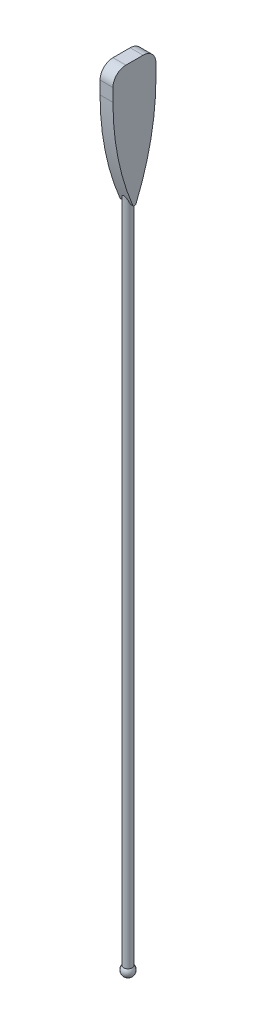
ISO-10303-21;
HEADER;
FILE_DESCRIPTION(('STEP AP214'),'2;1');
FILE_NAME('part.step','',(''),(''),'','','');
FILE_SCHEMA(('AUTOMOTIVE_DESIGN { 1 0 10303 214 1 1 1 1 }'));
ENDSEC;
DATA;
#1=APPLICATION_CONTEXT('core data for automotive mechanical design processes');
#2=APPLICATION_PROTOCOL_DEFINITION('international standard','automotive_design',2000,#1);
#3=PRODUCT_CONTEXT('',#1,'mechanical');
#4=PRODUCT('Part','Part','',(#3));
#5=PRODUCT_RELATED_PRODUCT_CATEGORY('part','',(#4));
#6=PRODUCT_DEFINITION_FORMATION('','',#4);
#7=PRODUCT_DEFINITION_CONTEXT('part definition',#1,'design');
#8=PRODUCT_DEFINITION('design','',#6,#7);
#9=PRODUCT_DEFINITION_SHAPE('','',#8);
#10=(LENGTH_UNIT() NAMED_UNIT(*) SI_UNIT(.MILLI.,.METRE.));
#11=(NAMED_UNIT(*) PLANE_ANGLE_UNIT() SI_UNIT($,.RADIAN.));
#12=(NAMED_UNIT(*) SI_UNIT($,.STERADIAN.) SOLID_ANGLE_UNIT());
#13=UNCERTAINTY_MEASURE_WITH_UNIT(LENGTH_MEASURE(1.E-05),#10,'distance_accuracy_value','');
#14=(GEOMETRIC_REPRESENTATION_CONTEXT(3) GLOBAL_UNCERTAINTY_ASSIGNED_CONTEXT((#13)) GLOBAL_UNIT_ASSIGNED_CONTEXT((#10,
#11,#12)) REPRESENTATION_CONTEXT('',''));
#15=CARTESIAN_POINT('',(0.,0.,0.));
#16=DIRECTION('',(0.,0.,1.));
#17=DIRECTION('',(1.,0.,0.));
#18=AXIS2_PLACEMENT_3D('',#15,#16,#17);
#19=CARTESIAN_POINT('',(0.,46.,0.));
#20=DIRECTION('',(0.,1.,0.));
#21=DIRECTION('',(-1.,0.,0.));
#22=AXIS2_PLACEMENT_3D('',#19,#20,#21);
#23=CYLINDRICAL_SURFACE('',#22,0.250000000000003);
#24=CARTESIAN_POINT('',(0.,0.226271736645453,0.));
#25=DIRECTION('',(0.,1.,0.));
#26=DIRECTION('',(-1.,0.,0.));
#27=AXIS2_PLACEMENT_3D('',#24,#25,#26);
#28=CIRCLE('',#27,0.25);
#29=CARTESIAN_POINT('',(-0.249999999999994,0.226271736645453,0.));
#30=VERTEX_POINT('',#29);
#31=EDGE_CURVE('E158',#30,#30,#28,.T.);
#32=ORIENTED_EDGE('',*,*,#31,.T.);
#33=EDGE_LOOP('',(#32));
#34=FACE_BOUND('',#33,.T.);
#35=CARTESIAN_POINT('',(-0.250000000000002,38.5052105958591,0.));
#36=CARTESIAN_POINT('',(-0.249999842543184,38.5366312632142,0.0136989494232212));
#37=CARTESIAN_POINT('',(-0.248879926101034,38.5680975482591,0.0272893989177539));
#38=CARTESIAN_POINT('',(-0.244435107894464,38.6309903938325,0.054198497885878));
#39=CARTESIAN_POINT('',(-0.241110239558626,38.6624169549561,0.0675171514769262));
#40=CARTESIAN_POINT('',(-0.232115953732347,38.7252729094795,0.0939046005377676));
#41=CARTESIAN_POINT('',(-0.226432614591263,38.756701192727,0.10697142199832));
#42=CARTESIAN_POINT('',(-0.212399886787121,38.8190910718342,0.13266587944311));
#43=CARTESIAN_POINT('',(-0.204054068522488,38.8500532348652,0.145294078616799));
#44=CARTESIAN_POINT('',(-0.183951385095789,38.9113633624454,0.170065761442661));
#45=CARTESIAN_POINT('',(-0.172175159533656,38.9417067649878,0.182206036124886));
#46=CARTESIAN_POINT('',(-0.150804609444333,38.985567903877,0.199598072160068));
#47=CARTESIAN_POINT('',(-0.143107010601811,38.9998508842895,0.205235028401046));
#48=CARTESIAN_POINT('',(-0.126076899123016,39.0275497703194,0.216119946348685));
#49=CARTESIAN_POINT('',(-0.11674967046122,39.0409682920755,0.221369089545257));
#50=CARTESIAN_POINT('',(-0.100751462483137,39.0602413612992,0.228879712209256));
#51=CARTESIAN_POINT('',(-0.0949022893026338,39.0666786649374,0.23138271195135));
#52=CARTESIAN_POINT('',(-0.082421085376727,39.0788783047938,0.236117471366797));
#53=CARTESIAN_POINT('',(-0.0757893046812715,39.0846408554352,0.238349317216126));
#54=CARTESIAN_POINT('',(-0.0633282138400703,39.093850010328,0.24191054182887));
#55=CARTESIAN_POINT('',(-0.0576915524361785,39.0975198958427,0.243327724579282));
#56=CARTESIAN_POINT('',(-0.0458738688724719,39.1040028322545,0.245828900951743));
#57=CARTESIAN_POINT('',(-0.0396939309828753,39.1068175420078,0.246913539675141));
#58=CARTESIAN_POINT('',(-0.0283181857865442,39.1107846519105,0.248441393034151));
#59=CARTESIAN_POINT('',(-0.0232164669001566,39.1121691534189,0.248974241624185));
#60=CARTESIAN_POINT('',(-0.0128367415336553,39.1141182157389,0.249724230786358));
#61=CARTESIAN_POINT('',(-0.00755893494560432,39.1146836759503,0.249941717661488));
#62=CARTESIAN_POINT('',(0.00303395590436785,39.1149334784053,0.250037806586286));
#63=CARTESIAN_POINT('',(0.00834909916075373,39.1146157080067,0.249915596097273));
#64=CARTESIAN_POINT('',(0.0188417672772986,39.1131313558093,0.249344513413491));
#65=CARTESIAN_POINT('',(0.0240191640926846,39.111964011012,0.248895347581789));
#66=CARTESIAN_POINT('',(0.0354297272937336,39.1084948909117,0.247559675573993));
#67=CARTESIAN_POINT('',(0.0415864345270877,39.1059767654535,0.246589704461534));
#68=CARTESIAN_POINT('',(0.0533884895246544,39.1000577518847,0.244307193625041));
#69=CARTESIAN_POINT('',(0.0590327019780229,39.0966549654336,0.242993917189125));
#70=CARTESIAN_POINT('',(0.0733433392008322,39.0867820632865,0.239178474104178));
#71=CARTESIAN_POINT('',(0.0815681310684482,39.0797626236356,0.236460973123727));
#72=CARTESIAN_POINT('',(0.0968567345089884,39.0647140850888,0.230619927147418));
#73=CARTESIAN_POINT('',(0.10391710137983,39.0566821102499,0.227495224672796));
#74=CARTESIAN_POINT('',(0.124654008211357,39.0305088498231,0.217284208016029));
#75=CARTESIAN_POINT('',(0.136704099724316,39.0112754504769,0.20974026295806));
#76=CARTESIAN_POINT('',(0.158127987241381,38.9716200014909,0.194083980870858));
#77=CARTESIAN_POINT('',(0.16749316330188,38.9511943712935,0.185969915011687));
#78=CARTESIAN_POINT('',(0.186008575976551,38.9053672569837,0.167643892804509));
#79=CARTESIAN_POINT('',(0.194705775111867,38.8798171995455,0.157347605768155));
#80=CARTESIAN_POINT('',(0.209920999032928,38.8282128178008,0.13638215326602));
#81=CARTESIAN_POINT('',(0.216436360091374,38.8021579178866,0.125712549448057));
#82=CARTESIAN_POINT('',(0.227631197155939,38.7497558258672,0.10407866991745));
#83=CARTESIAN_POINT('',(0.232309209323028,38.7234084178309,0.0931141666551451));
#84=CARTESIAN_POINT('',(0.240008385738885,38.6705709088051,0.0709470704389193));
#85=CARTESIAN_POINT('',(0.243029256575525,38.6440807833841,0.0597444356861377));
#86=CARTESIAN_POINT('',(0.247903161025013,38.5862028901454,0.0350703890166627));
#87=CARTESIAN_POINT('',(0.249441596180243,38.5548053874181,0.0215587291286461));
#88=CARTESIAN_POINT('',(0.250306393141336,38.4920886765381,-0.00568588305082801));
#89=CARTESIAN_POINT('',(0.249633477085576,38.4607694461678,-0.0194187616436532));
#90=CARTESIAN_POINT('',(0.245924445477035,38.398261968943,-0.0470819752211496));
#91=CARTESIAN_POINT('',(0.242882874780455,38.3670741917531,-0.0610126930355195));
#92=CARTESIAN_POINT('',(0.234105707267574,38.3051442553238,-0.0889269417668847));
#93=CARTESIAN_POINT('',(0.228372892397663,38.2744016696382,-0.102910403390357));
#94=CARTESIAN_POINT('',(0.212577651076367,38.209223398905,-0.132820326544747));
#95=CARTESIAN_POINT('',(0.202011043311231,38.1748926024046,-0.148736935352021));
#96=CARTESIAN_POINT('',(0.181673203223111,38.1250981077201,-0.172041276316915));
#97=CARTESIAN_POINT('',(0.17417626485104,38.108831727068,-0.179691287338004));
#98=CARTESIAN_POINT('',(0.157286720566268,38.0771640781251,-0.194651181227881));
#99=CARTESIAN_POINT('',(0.147898947587038,38.0617607297108,-0.201961873924487));
#100=CARTESIAN_POINT('',(0.130338751059986,38.0375598045104,-0.21349455870879));
#101=CARTESIAN_POINT('',(0.122886283826979,38.0283334796493,-0.217903803546471));
#102=CARTESIAN_POINT('',(0.106685898006643,38.0108544607709,-0.226277030141082));
#103=CARTESIAN_POINT('',(0.097940408806873,38.0025999919329,-0.230241822909516));
#104=CARTESIAN_POINT('',(0.0822502277088504,37.9902726818372,-0.236174496021412));
#105=CARTESIAN_POINT('',(0.0757457535122561,37.9857471384817,-0.238355757257779));
#106=CARTESIAN_POINT('',(0.0620582720332415,37.9776153469697,-0.242279292494612));
#107=CARTESIAN_POINT('',(0.0548762446801801,37.9740077982522,-0.244022187505576));
#108=CARTESIAN_POINT('',(0.041376613599265,37.968617775308,-0.246628070941218));
#109=CARTESIAN_POINT('',(0.0351684310195602,37.966615565642,-0.247596857201613));
#110=CARTESIAN_POINT('',(0.0224676963090928,37.9635716902756,-0.249070110835002));
#111=CARTESIAN_POINT('',(0.0159754603843543,37.9625289835971,-0.249575081406951));
#112=CARTESIAN_POINT('',(0.00285792015544403,37.9615068262094,-0.250070096902381));
#113=CARTESIAN_POINT('',(-0.00376783370795528,37.9615319308803,-0.250057935694891));
#114=CARTESIAN_POINT('',(-0.0169067856411382,37.9626542055147,-0.249514441629974));
#115=CARTESIAN_POINT('',(-0.0234199253368837,37.963751915459,-0.248982847274791));
#116=CARTESIAN_POINT('',(-0.0357929358363062,37.9668183925998,-0.247498723653899));
#117=CARTESIAN_POINT('',(-0.0416690102770419,37.9687355692515,-0.246571128776427));
#118=CARTESIAN_POINT('',(-0.0530650727416732,37.9732836024129,-0.244372303345235));
#119=CARTESIAN_POINT('',(-0.0585849461494059,37.9759146872361,-0.243100962859405));
#120=CARTESIAN_POINT('',(-0.073004040531694,37.9838120166349,-0.239288535438091));
#121=CARTESIAN_POINT('',(-0.0815329539724472,37.9896260751965,-0.236485264117641));
#122=CARTESIAN_POINT('',(-0.0975123866568199,38.0023592929943,-0.230358143592917));
#123=CARTESIAN_POINT('',(-0.104959153338396,38.0092821305717,-0.22703256237898));
#124=CARTESIAN_POINT('',(-0.124668153457139,38.0298637705619,-0.217167634793139));
#125=CARTESIAN_POINT('',(-0.135838816567932,38.0443704745172,-0.210239151019991));
#126=CARTESIAN_POINT('',(-0.155866323759781,38.0746367288417,-0.195849640089945));
#127=CARTESIAN_POINT('',(-0.164716558004631,38.0903996949199,-0.188387167082427));
#128=CARTESIAN_POINT('',(-0.181272757208756,38.1239633587513,-0.172572875127251));
#129=CARTESIAN_POINT('',(-0.188829256013077,38.1418259457979,-0.164197822612869));
#130=CARTESIAN_POINT('',(-0.202296698708344,38.1780935710061,-0.147283296343639));
#131=CARTESIAN_POINT('',(-0.208205775421729,38.1964991987403,-0.138743647657407));
#132=CARTESIAN_POINT('',(-0.223907567529809,38.2522572865218,-0.113014215699204));
#133=CARTESIAN_POINT('',(-0.231668656907835,38.2901370159082,-0.0957205216536915));
#134=CARTESIAN_POINT('',(-0.241720434013999,38.3575593750897,-0.0652837439193218));
#135=CARTESIAN_POINT('',(-0.244866162795844,38.3869790844801,-0.0521162078479225));
#136=CARTESIAN_POINT('',(-0.24900447256069,38.4459894097682,-0.0259337457902483));
#137=CARTESIAN_POINT('',(-0.250000148487735,38.4755797184445,-0.0129186272996857));
#138=CARTESIAN_POINT('',(-0.250000000000002,38.5052105958591,0.));
#139=B_SPLINE_CURVE_WITH_KNOTS('',3,(#35,#36,#37,#38,#39,#40,#41,#42,#43,#44,#45,#46,#47,#48,
#49,#50,#51,#52,#53,#54,#55,#56,#57,#58,#59,#60,#61,#62,#63,#64,#65,#66,#67,#68,#69,#70,#71,#72,
#73,#74,#75,#76,#77,#78,#79,#80,#81,#82,#83,#84,#85,#86,#87,#88,#89,#90,#91,#92,#93,#94,#95,#96,
#97,#98,#99,#100,#101,#102,#103,#104,#105,#106,#107,#108,#109,#110,#111,#112,#113,#114,#115,
#116,#117,#118,#119,#120,#121,#122,#123,#124,#125,#126,#127,#128,#129,#130,#131,#132,#133,#134,
#135,#136,#137,#138),.UNSPECIFIED.,.T.,.F.,(4,2,2,2,2,2,2,2,2,2,2,2,2,2,2,2,2,2,2,2,2,2,2,2,2,2,
2,2,2,2,2,2,2,2,2,2,2,2,2,2,2,2,2,2,2,2,2,2,2,2,2,4),(0.,0.102810897254659,0.205620235861322,
0.309045272945264,0.412332195431075,0.51621372854513,0.567684812734676,0.618992001627462,
0.646102248326233,0.673203856397543,0.693764209350875,0.714284421211985,0.730157378469917,
0.746012892182856,0.761906364086191,0.777814127474554,0.797867293881379,0.817963851528492,
0.851222154398603,0.884577145415487,0.955933007735706,1.02751545687714,1.11404189954677,
1.2006735973459,1.28737417637946,1.37409010159793,1.47666429472029,1.57920499456514,
1.68198255229129,1.78465410173247,1.90209475468634,1.96045176293709,2.01866146274298,
2.05654863767419,2.09436551239051,2.11895370984047,2.14350687575591,2.16321078070179,
2.18289328331804,2.20265976166154,2.22243619615477,2.24111771496128,2.2598052153217,
2.29170648014473,2.32371585629902,2.38211528546183,2.44067930354246,2.50395774210648,
2.56730761115179,2.69405672599844,2.79115114793457,2.88810571159825),.UNSPECIFIED.);
#140=CARTESIAN_POINT('',(-0.232344689571997,38.7214852793369,0.0922818791946368));
#141=VERTEX_POINT('',#140);
#142=CARTESIAN_POINT('',(0.232344689571998,38.7214852793369,0.0922818791946368));
#143=VERTEX_POINT('',#142);
#144=EDGE_CURVE('E13',#141,#143,#139,.T.);
#145=ORIENTED_EDGE('',*,*,#144,.F.);
#146=CARTESIAN_POINT('',(-0.250000000000002,38.660008710808,0.));
#147=CARTESIAN_POINT('',(-0.249999635613546,38.6600092033992,-0.00537465027214389));
#148=CARTESIAN_POINT('',(-0.249824647153477,38.6604445984124,-0.0107586282045326));
#149=CARTESIAN_POINT('',(-0.249141726550314,38.6621710959841,-0.0213748240208935));
#150=CARTESIAN_POINT('',(-0.248632889349406,38.6634645247623,-0.0266065888780613));
#151=CARTESIAN_POINT('',(-0.247337104606595,38.6668525147109,-0.0367476961363708));
#152=CARTESIAN_POINT('',(-0.246551068182166,38.6689444531189,-0.0416580330808503));
#153=CARTESIAN_POINT('',(-0.244778305397912,38.6738596694743,-0.051053598516418));
#154=CARTESIAN_POINT('',(-0.243791648728551,38.6766826935539,-0.055538973837545));
#155=CARTESIAN_POINT('',(-0.241665443085711,38.6831204857361,-0.0641750503785246));
#156=CARTESIAN_POINT('',(-0.240521148466498,38.6867640436201,-0.0683031136275302));
#157=CARTESIAN_POINT('',(-0.238230288451196,38.6946787109817,-0.0759087502392205));
#158=CARTESIAN_POINT('',(-0.237083722219786,38.6989501256682,-0.0793860053566114));
#159=CARTESIAN_POINT('',(-0.234861395905999,38.7082301143205,-0.0857437283647131));
#160=CARTESIAN_POINT('',(-0.233791058010777,38.7132630351108,-0.0885907490600371));
#161=CARTESIAN_POINT('',(-0.231916823565111,38.7237855307274,-0.0933877359515975));
#162=CARTESIAN_POINT('',(-0.231112800516392,38.7292748871944,-0.0953381282133148));
#163=CARTESIAN_POINT('',(-0.229913178931762,38.7402943274892,-0.0981949411696642));
#164=CARTESIAN_POINT('',(-0.229500710547118,38.7458112725993,-0.0991446982922452));
#165=CARTESIAN_POINT('',(-0.229082002390555,38.756940460738,-0.100108648084104));
#166=CARTESIAN_POINT('',(-0.229075562856324,38.7625526555452,-0.100123300815841));
#167=CARTESIAN_POINT('',(-0.229455250051814,38.7732965443795,-0.0992494683747256));
#168=CARTESIAN_POINT('',(-0.22981408749558,38.7784344965281,-0.0984237657151216));
#169=CARTESIAN_POINT('',(-0.230838093827572,38.7884916886087,-0.0959973440150245));
#170=CARTESIAN_POINT('',(-0.231503316167237,38.7934108902136,-0.0943964897402672));
#171=CARTESIAN_POINT('',(-0.233079742537739,38.8030096026177,-0.0904347366275159));
#172=CARTESIAN_POINT('',(-0.233995689638642,38.8076821727607,-0.0880589931157551));
#173=CARTESIAN_POINT('',(-0.235969058196702,38.8165795016261,-0.0826253230366191));
#174=CARTESIAN_POINT('',(-0.237026532728913,38.8208040912782,-0.0795671402550429));
#175=CARTESIAN_POINT('',(-0.239263368370614,38.8290291972481,-0.072577529972716));
#176=CARTESIAN_POINT('',(-0.240445832487938,38.8329871472803,-0.0685968731485282));
#177=CARTESIAN_POINT('',(-0.242729912479284,38.8401929347081,-0.0600157213715075));
#178=CARTESIAN_POINT('',(-0.243831512222703,38.8434406306785,-0.0554151032667193));
#179=CARTESIAN_POINT('',(-0.245857340632238,38.8491895831788,-0.0456038826302911));
#180=CARTESIAN_POINT('',(-0.246777635047699,38.8516748248679,-0.0403830245673243));
#181=CARTESIAN_POINT('',(-0.248307414164391,38.8557171038619,-0.029551188274146));
#182=CARTESIAN_POINT('',(-0.248917056731194,38.8572746126859,-0.0239404098424855));
#183=CARTESIAN_POINT('',(-0.249728069753456,38.859331125579,-0.0128447943803923));
#184=CARTESIAN_POINT('',(-0.249951472916762,38.8598873335207,-0.00737216469927754));
#185=CARTESIAN_POINT('',(-0.250034239255314,38.8600943658344,0.00359226549039055));
#186=CARTESIAN_POINT('',(-0.249893696791132,38.8597454248854,0.00908406066119587));
#187=CARTESIAN_POINT('',(-0.249278783531893,38.8581941231804,0.0196716369561017));
#188=CARTESIAN_POINT('',(-0.248819695672818,38.8570308117905,0.0247741245887786));
#189=CARTESIAN_POINT('',(-0.247629720702697,38.8539369253925,0.0347067714030372));
#190=CARTESIAN_POINT('',(-0.246898798678064,38.8520062518246,0.0395368955112311));
#191=CARTESIAN_POINT('',(-0.245208297385618,38.847369463824,0.0489539392908464));
#192=CARTESIAN_POINT('',(-0.244242407990698,38.8446414372058,0.0535289011378143));
#193=CARTESIAN_POINT('',(-0.242186682371969,38.8385116946128,0.0621721795622865));
#194=CARTESIAN_POINT('',(-0.241096796552168,38.8351097086622,0.0662402920378968));
#195=CARTESIAN_POINT('',(-0.238822558822223,38.8274652101602,0.0740361521516137));
#196=CARTESIAN_POINT('',(-0.237636720724702,38.8231820337314,0.0777236966909652));
#197=CARTESIAN_POINT('',(-0.235370836446391,38.8140367066588,0.0843375598700257));
#198=CARTESIAN_POINT('',(-0.234290807717713,38.8091744607958,0.0872637530644042));
#199=CARTESIAN_POINT('',(-0.23235715000007,38.7989356260747,0.0922903750984862));
#200=CARTESIAN_POINT('',(-0.231505815615215,38.7935545108317,0.0943825297351004));
#201=CARTESIAN_POINT('',(-0.23016183687333,38.7824720282058,0.0976148109936688));
#202=CARTESIAN_POINT('',(-0.229668927817502,38.7767709005123,0.0987556402654683));
#203=CARTESIAN_POINT('',(-0.22913587967833,38.7656523157253,0.0999857808619217));
#204=CARTESIAN_POINT('',(-0.229065710728984,38.7602439688351,0.100144854115139));
#205=CARTESIAN_POINT('',(-0.229307418259225,38.749481467926,0.0995901579648114));
#206=CARTESIAN_POINT('',(-0.229619246226371,38.7441273071126,0.0988764993955588));
#207=CARTESIAN_POINT('',(-0.2305633244783,38.733842101313,0.0966535683072672));
#208=CARTESIAN_POINT('',(-0.231182415897292,38.7289026970858,0.0951768746784385));
#209=CARTESIAN_POINT('',(-0.232662000632788,38.7193397793279,0.0915002724246651));
#210=CARTESIAN_POINT('',(-0.233522560607523,38.7147163534632,0.0893001640697245));
#211=CARTESIAN_POINT('',(-0.235449304797469,38.7056282298443,0.084093638137958));
#212=CARTESIAN_POINT('',(-0.236524441155338,38.7011877773014,0.0810482667579701));
#213=CARTESIAN_POINT('',(-0.238731902187403,38.6928590449479,0.0742946059635875));
#214=CARTESIAN_POINT('',(-0.239864244024558,38.6889709322016,0.0705861167409116));
#215=CARTESIAN_POINT('',(-0.242146783543322,38.6815985681448,0.0623252753136219));
#216=CARTESIAN_POINT('',(-0.243293378980994,38.6781568454631,0.0577338000573066));
#217=CARTESIAN_POINT('',(-0.245400203356961,38.6720918586769,0.0479950160142887));
#218=CARTESIAN_POINT('',(-0.246360345546482,38.6694689752004,0.0428474502273609));
#219=CARTESIAN_POINT('',(-0.247969857407906,38.6651776000485,0.032236903124759));
#220=CARTESIAN_POINT('',(-0.248624681527509,38.66349224463,0.0267815809109842));
#221=CARTESIAN_POINT('',(-0.249572153104692,38.6610767547603,0.0156438273140611));
#222=CARTESIAN_POINT('',(-0.249865949747822,38.6603435889708,0.00996217629294576));
#223=CARTESIAN_POINT('',(-0.24998794975207,38.6600389417591,0.00284561489454673));
#224=CARTESIAN_POINT('',(-0.250000096484589,38.6600085803765,0.00142313443703805));
#225=CARTESIAN_POINT('',(-0.250000000000002,38.660008710808,0.));
#226=B_SPLINE_CURVE_WITH_KNOTS('',3,(#146,#147,#148,#149,#150,#151,#152,#153,#154,#155,#156,
#157,#158,#159,#160,#161,#162,#163,#164,#165,#166,#167,#168,#169,#170,#171,#172,#173,#174,#175,
#176,#177,#178,#179,#180,#181,#182,#183,#184,#185,#186,#187,#188,#189,#190,#191,#192,#193,#194,
#195,#196,#197,#198,#199,#200,#201,#202,#203,#204,#205,#206,#207,#208,#209,#210,#211,#212,#213,
#214,#215,#216,#217,#218,#219,#220,#221,#222,#223,#224,#225),.UNSPECIFIED.,.T.,.F.,(4,2,2,2,2,2,
2,2,2,2,2,2,2,2,2,2,2,2,2,2,2,2,2,2,2,2,2,2,2,2,2,2,2,2,2,2,2,2,2,4),(0.,0.0161201493946517,
0.032284181800397,0.0483955728735804,0.0645013767839946,0.0812986908502042,0.0981041974672092,
0.115657629409612,0.133202711559132,0.149952052641675,0.166693153144264,0.182269164174702,
0.19784789360204,0.213744563123428,0.229647210943112,0.246779174567302,0.263914546393882,
0.281388456555417,0.298853478030909,0.315284592238019,0.331711446759058,0.347400227756202,
0.363091024470914,0.379261756673147,0.395438979723505,0.412684237286223,0.429932334495886,
0.447347522540361,0.464749836288184,0.480899836653394,0.497047786230552,0.512557159223404,
0.528070817851602,0.544472733977368,0.56087960062322,0.578350211715946,0.595828931769296,
0.612982150455686,0.630080626151198,0.634349022897425),.UNSPECIFIED.);
#227=CARTESIAN_POINT('',(-0.232344689571999,38.7214852793369,-0.0922818791946309));
#228=VERTEX_POINT('',#227);
#229=EDGE_CURVE('E64',#141,#228,#226,.T.);
#230=ORIENTED_EDGE('',*,*,#229,.T.);
#231=CARTESIAN_POINT('',(-0.250000000000002,38.5052105958591,0.));
#232=CARTESIAN_POINT('',(-0.249999842543184,38.5366312632142,-0.0136989494232212));
#233=CARTESIAN_POINT('',(-0.248879926101034,38.5680975482591,-0.0272893989177539));
#234=CARTESIAN_POINT('',(-0.244435107894464,38.6309903938325,-0.054198497885878));
#235=CARTESIAN_POINT('',(-0.241110239558626,38.6624169549561,-0.0675171514769262));
#236=CARTESIAN_POINT('',(-0.232115953732347,38.7252729094795,-0.0939046005377676));
#237=CARTESIAN_POINT('',(-0.226432614591263,38.756701192727,-0.10697142199832));
#238=CARTESIAN_POINT('',(-0.212399886787121,38.8190910718342,-0.13266587944311));
#239=CARTESIAN_POINT('',(-0.204054068522488,38.8500532348652,-0.145294078616799));
#240=CARTESIAN_POINT('',(-0.183951385095789,38.9113633624454,-0.170065761442661));
#241=CARTESIAN_POINT('',(-0.172175159533656,38.9417067649878,-0.182206036124886));
#242=CARTESIAN_POINT('',(-0.150804609444333,38.985567903877,-0.199598072160068));
#243=CARTESIAN_POINT('',(-0.143107010601811,38.9998508842895,-0.205235028401046));
#244=CARTESIAN_POINT('',(-0.126076899123016,39.0275497703194,-0.216119946348685));
#245=CARTESIAN_POINT('',(-0.11674967046122,39.0409682920755,-0.221369089545257));
#246=CARTESIAN_POINT('',(-0.100751462483137,39.0602413612992,-0.228879712209256));
#247=CARTESIAN_POINT('',(-0.0949022893026338,39.0666786649374,-0.23138271195135));
#248=CARTESIAN_POINT('',(-0.082421085376727,39.0788783047938,-0.236117471366797));
#249=CARTESIAN_POINT('',(-0.0757893046812715,39.0846408554352,-0.238349317216126));
#250=CARTESIAN_POINT('',(-0.0633282138400703,39.093850010328,-0.24191054182887));
#251=CARTESIAN_POINT('',(-0.0576915524361785,39.0975198958427,-0.243327724579282));
#252=CARTESIAN_POINT('',(-0.0458738688724719,39.1040028322545,-0.245828900951743));
#253=CARTESIAN_POINT('',(-0.0396939309828753,39.1068175420078,-0.246913539675141));
#254=CARTESIAN_POINT('',(-0.0283181857865442,39.1107846519105,-0.248441393034151));
#255=CARTESIAN_POINT('',(-0.0232164669001566,39.1121691534189,-0.248974241624185));
#256=CARTESIAN_POINT('',(-0.0128367415336553,39.1141182157389,-0.249724230786358));
#257=CARTESIAN_POINT('',(-0.00755893494560432,39.1146836759503,-0.249941717661488));
#258=CARTESIAN_POINT('',(0.00303395590436785,39.1149334784053,-0.250037806586286));
#259=CARTESIAN_POINT('',(0.00834909916075373,39.1146157080067,-0.249915596097273));
#260=CARTESIAN_POINT('',(0.0188417672772986,39.1131313558093,-0.249344513413491));
#261=CARTESIAN_POINT('',(0.0240191640926846,39.111964011012,-0.248895347581789));
#262=CARTESIAN_POINT('',(0.0354297272937336,39.1084948909117,-0.247559675573993));
#263=CARTESIAN_POINT('',(0.0415864345270877,39.1059767654535,-0.246589704461534));
#264=CARTESIAN_POINT('',(0.0533884895246544,39.1000577518847,-0.244307193625041));
#265=CARTESIAN_POINT('',(0.0590327019780229,39.0966549654336,-0.242993917189125));
#266=CARTESIAN_POINT('',(0.0733433392008322,39.0867820632865,-0.239178474104178));
#267=CARTESIAN_POINT('',(0.0815681310684482,39.0797626236356,-0.236460973123727));
#268=CARTESIAN_POINT('',(0.0968567345089884,39.0647140850888,-0.230619927147418));
#269=CARTESIAN_POINT('',(0.10391710137983,39.0566821102499,-0.227495224672796));
#270=CARTESIAN_POINT('',(0.124654008211357,39.0305088498231,-0.217284208016029));
#271=CARTESIAN_POINT('',(0.136704099724316,39.0112754504769,-0.20974026295806));
#272=CARTESIAN_POINT('',(0.158127987241381,38.9716200014909,-0.194083980870858));
#273=CARTESIAN_POINT('',(0.16749316330188,38.9511943712935,-0.185969915011687));
#274=CARTESIAN_POINT('',(0.186008575976551,38.9053672569837,-0.167643892804509));
#275=CARTESIAN_POINT('',(0.194705775111867,38.8798171995455,-0.157347605768155));
#276=CARTESIAN_POINT('',(0.209920999032928,38.8282128178008,-0.13638215326602));
#277=CARTESIAN_POINT('',(0.216436360091374,38.8021579178866,-0.125712549448057));
#278=CARTESIAN_POINT('',(0.227631197155939,38.7497558258672,-0.10407866991745));
#279=CARTESIAN_POINT('',(0.232309209323028,38.7234084178309,-0.0931141666551451));
#280=CARTESIAN_POINT('',(0.240008385738885,38.6705709088051,-0.0709470704389193));
#281=CARTESIAN_POINT('',(0.243029256575525,38.6440807833841,-0.0597444356861377));
#282=CARTESIAN_POINT('',(0.247903161025013,38.5862028901454,-0.0350703890166627));
#283=CARTESIAN_POINT('',(0.249441596180243,38.5548053874181,-0.0215587291286461));
#284=CARTESIAN_POINT('',(0.250306393141336,38.4920886765381,0.00568588305082801));
#285=CARTESIAN_POINT('',(0.249633477085576,38.4607694461678,0.0194187616436532));
#286=CARTESIAN_POINT('',(0.245924445477035,38.398261968943,0.0470819752211496));
#287=CARTESIAN_POINT('',(0.242882874780455,38.3670741917531,0.0610126930355195));
#288=CARTESIAN_POINT('',(0.234105707267574,38.3051442553238,0.0889269417668847));
#289=CARTESIAN_POINT('',(0.228372892397663,38.2744016696382,0.102910403390357));
#290=CARTESIAN_POINT('',(0.212577651076367,38.209223398905,0.132820326544747));
#291=CARTESIAN_POINT('',(0.202011043311231,38.1748926024046,0.148736935352021));
#292=CARTESIAN_POINT('',(0.181673203223111,38.1250981077201,0.172041276316915));
#293=CARTESIAN_POINT('',(0.17417626485104,38.108831727068,0.179691287338004));
#294=CARTESIAN_POINT('',(0.157286720566268,38.0771640781251,0.194651181227881));
#295=CARTESIAN_POINT('',(0.147898947587038,38.0617607297108,0.201961873924487));
#296=CARTESIAN_POINT('',(0.130338751059986,38.0375598045104,0.21349455870879));
#297=CARTESIAN_POINT('',(0.122886283826979,38.0283334796493,0.217903803546471));
#298=CARTESIAN_POINT('',(0.106685898006643,38.0108544607709,0.226277030141082));
#299=CARTESIAN_POINT('',(0.097940408806873,38.0025999919329,0.230241822909516));
#300=CARTESIAN_POINT('',(0.0822502277088504,37.9902726818372,0.236174496021412));
#301=CARTESIAN_POINT('',(0.0757457535122561,37.9857471384817,0.238355757257779));
#302=CARTESIAN_POINT('',(0.0620582720332415,37.9776153469697,0.242279292494612));
#303=CARTESIAN_POINT('',(0.0548762446801801,37.9740077982522,0.244022187505576));
#304=CARTESIAN_POINT('',(0.041376613599265,37.968617775308,0.246628070941218));
#305=CARTESIAN_POINT('',(0.0351684310195602,37.966615565642,0.247596857201613));
#306=CARTESIAN_POINT('',(0.0224676963090928,37.9635716902756,0.249070110835002));
#307=CARTESIAN_POINT('',(0.0159754603843543,37.9625289835971,0.249575081406951));
#308=CARTESIAN_POINT('',(0.00285792015544403,37.9615068262094,0.250070096902381));
#309=CARTESIAN_POINT('',(-0.00376783370795528,37.9615319308803,0.250057935694891));
#310=CARTESIAN_POINT('',(-0.0169067856411382,37.9626542055147,0.249514441629974));
#311=CARTESIAN_POINT('',(-0.0234199253368837,37.963751915459,0.248982847274791));
#312=CARTESIAN_POINT('',(-0.0357929358363062,37.9668183925998,0.247498723653899));
#313=CARTESIAN_POINT('',(-0.0416690102770419,37.9687355692515,0.246571128776427));
#314=CARTESIAN_POINT('',(-0.0530650727416732,37.9732836024129,0.244372303345235));
#315=CARTESIAN_POINT('',(-0.0585849461494059,37.9759146872361,0.243100962859405));
#316=CARTESIAN_POINT('',(-0.073004040531694,37.9838120166349,0.239288535438091));
#317=CARTESIAN_POINT('',(-0.0815329539724472,37.9896260751965,0.236485264117641));
#318=CARTESIAN_POINT('',(-0.0975123866568199,38.0023592929943,0.230358143592917));
#319=CARTESIAN_POINT('',(-0.104959153338396,38.0092821305717,0.22703256237898));
#320=CARTESIAN_POINT('',(-0.124668153457139,38.0298637705619,0.217167634793139));
#321=CARTESIAN_POINT('',(-0.135838816567932,38.0443704745172,0.210239151019991));
#322=CARTESIAN_POINT('',(-0.155866323759781,38.0746367288417,0.195849640089945));
#323=CARTESIAN_POINT('',(-0.164716558004631,38.0903996949199,0.188387167082427));
#324=CARTESIAN_POINT('',(-0.181272757208756,38.1239633587513,0.172572875127251));
#325=CARTESIAN_POINT('',(-0.188829256013077,38.1418259457979,0.164197822612869));
#326=CARTESIAN_POINT('',(-0.202296698708344,38.1780935710061,0.147283296343639));
#327=CARTESIAN_POINT('',(-0.208205775421729,38.1964991987403,0.138743647657407));
#328=CARTESIAN_POINT('',(-0.223907567529809,38.2522572865218,0.113014215699204));
#329=CARTESIAN_POINT('',(-0.231668656907835,38.2901370159082,0.0957205216536915));
#330=CARTESIAN_POINT('',(-0.241720434013999,38.3575593750897,0.0652837439193218));
#331=CARTESIAN_POINT('',(-0.244866162795844,38.3869790844801,0.0521162078479225));
#332=CARTESIAN_POINT('',(-0.24900447256069,38.4459894097682,0.0259337457902483));
#333=CARTESIAN_POINT('',(-0.250000148487735,38.4755797184445,0.0129186272996857));
#334=CARTESIAN_POINT('',(-0.250000000000002,38.5052105958591,0.));
#335=B_SPLINE_CURVE_WITH_KNOTS('',3,(#231,#232,#233,#234,#235,#236,#237,#238,#239,#240,#241,
#242,#243,#244,#245,#246,#247,#248,#249,#250,#251,#252,#253,#254,#255,#256,#257,#258,#259,#260,
#261,#262,#263,#264,#265,#266,#267,#268,#269,#270,#271,#272,#273,#274,#275,#276,#277,#278,#279,
#280,#281,#282,#283,#284,#285,#286,#287,#288,#289,#290,#291,#292,#293,#294,#295,#296,#297,#298,
#299,#300,#301,#302,#303,#304,#305,#306,#307,#308,#309,#310,#311,#312,#313,#314,#315,#316,#317,
#318,#319,#320,#321,#322,#323,#324,#325,#326,#327,#328,#329,#330,#331,#332,#333,#334),
.UNSPECIFIED.,.T.,.F.,(4,2,2,2,2,2,2,2,2,2,2,2,2,2,2,2,2,2,2,2,2,2,2,2,2,2,2,2,2,2,2,2,2,2,2,2,
2,2,2,2,2,2,2,2,2,2,2,2,2,2,2,4),(0.,0.102810897254659,0.205620235861322,0.309045272945264,
0.412332195431075,0.51621372854513,0.567684812734676,0.618992001627462,0.646102248326233,
0.673203856397543,0.693764209350875,0.714284421211985,0.730157378469917,0.746012892182856,
0.761906364086191,0.777814127474554,0.797867293881379,0.817963851528492,0.851222154398603,
0.884577145415487,0.955933007735706,1.02751545687714,1.11404189954677,1.2006735973459,
1.28737417637946,1.37409010159793,1.47666429472029,1.57920499456514,1.68198255229129,
1.78465410173247,1.90209475468634,1.96045176293709,2.01866146274298,2.05654863767419,
2.09436551239051,2.11895370984047,2.14350687575591,2.16321078070179,2.18289328331804,
2.20265976166154,2.22243619615477,2.24111771496128,2.2598052153217,2.29170648014473,
2.32371585629902,2.38211528546183,2.44067930354246,2.50395774210648,2.56730761115179,
2.69405672599844,2.79115114793457,2.88810571159825),.UNSPECIFIED.);
#336=CARTESIAN_POINT('',(0.232344689572,38.7214852793369,-0.0922818791946321));
#337=VERTEX_POINT('',#336);
#338=EDGE_CURVE('E161',#228,#337,#335,.T.);
#339=ORIENTED_EDGE('',*,*,#338,.T.);
#340=CARTESIAN_POINT('',(0.229128784747796,38.760008710808,0.0999999999999998));
#341=CARTESIAN_POINT('',(0.229129325941264,38.7653656857044,0.0999994127122572));
#342=CARTESIAN_POINT('',(0.229319301775397,38.7707302375068,0.0995669909389545));
#343=CARTESIAN_POINT('',(0.230055457645714,38.7813054524161,0.0978534515385656));
#344=CARTESIAN_POINT('',(0.230602547841456,38.7865156866548,0.0965701652234542));
#345=CARTESIAN_POINT('',(0.2319802277489,38.796611357919,0.0932117516253399));
#346=CARTESIAN_POINT('',(0.232809748139177,38.8014979381794,0.0911396076254397));
#347=CARTESIAN_POINT('',(0.23465733258702,38.8108529633476,0.0862710134694106));
#348=CARTESIAN_POINT('',(0.235675355462764,38.8153214992646,0.0834747214636039));
#349=CARTESIAN_POINT('',(0.23785043251416,38.823971730921,0.0770660987291335));
#350=CARTESIAN_POINT('',(0.239011958976328,38.8281265319547,0.0734189678863032));
#351=CARTESIAN_POINT('',(0.241306228492458,38.8357851606735,0.0654854552887676));
#352=CARTESIAN_POINT('',(0.242438961369021,38.8392887608724,0.0611988510838035));
#353=CARTESIAN_POINT('',(0.244601703952566,38.8456790306572,0.0519003155178029));
#354=CARTESIAN_POINT('',(0.245625901841557,38.8485359258816,0.0468664482806106));
#355=CARTESIAN_POINT('',(0.247401963816008,38.8533508892275,0.036341266143761));
#356=CARTESIAN_POINT('',(0.248153938692401,38.8553093230971,0.030850138464399));
#357=CARTESIAN_POINT('',(0.249269162504089,38.8581757851299,0.0198483213419429));
#358=CARTESIAN_POINT('',(0.249649468387667,38.8591300765125,0.0143514492402299));
#359=CARTESIAN_POINT('',(0.25004015534137,38.8601101350911,0.00326331643188316));
#360=CARTESIAN_POINT('',(0.250050674384662,38.8601362486048,-0.00232790829126987));
#361=CARTESIAN_POINT('',(0.249710981410895,38.8592845723193,-0.0131116247357651));
#362=CARTESIAN_POINT('',(0.249380998385929,38.8584574721707,-0.0183088726437006));
#363=CARTESIAN_POINT('',(0.248424645734392,38.8560090669925,-0.0284836554609157));
#364=CARTESIAN_POINT('',(0.247798254360531,38.854387703688,-0.033461174219507));
#365=CARTESIAN_POINT('',(0.246298412228883,38.8503768866642,-0.0431448969255823));
#366=CARTESIAN_POINT('',(0.245421380233516,38.8479762250672,-0.0478458811689812));
#367=CARTESIAN_POINT('',(0.24350729258974,38.8424854604621,-0.0567904075370266));
#368=CARTESIAN_POINT('',(0.242470182132121,38.8393951211531,-0.0610337921358016));
#369=CARTESIAN_POINT('',(0.24026081858962,38.8323762540107,-0.0692384413996066));
#370=CARTESIAN_POINT('',(0.239084163261848,38.8284060161788,-0.073162892263686));
#371=CARTESIAN_POINT('',(0.236780830480669,38.819859182217,-0.0803053707692612));
#372=CARTESIAN_POINT('',(0.235654169481729,38.8152823884005,-0.0835231671879641));
#373=CARTESIAN_POINT('',(0.233548448727543,38.8054877596874,-0.0892452094371611));
#374=CARTESIAN_POINT('',(0.232574457115773,38.8002554692831,-0.0917267325868083));
#375=CARTESIAN_POINT('',(0.230943795208603,38.7893979362856,-0.095758812998252));
#376=CARTESIAN_POINT('',(0.230286918868078,38.7837729515721,-0.0973099749199852));
#377=CARTESIAN_POINT('',(0.229414879924452,38.7726569219374,-0.0993477474411448));
#378=CARTESIAN_POINT('',(0.229175183543046,38.7671786884506,-0.0998936048404775));
#379=CARTESIAN_POINT('',(0.229094749254702,38.7562048504163,-0.100078066322529));
#380=CARTESIAN_POINT('',(0.229253890363828,38.7507092516415,-0.0997169455292388));
#381=CARTESIAN_POINT('',(0.229928022100907,38.7401857640592,-0.0981516447392835));
#382=CARTESIAN_POINT('',(0.23042222887805,38.7351490639377,-0.0969966531011336));
#383=CARTESIAN_POINT('',(0.231685025534785,38.725344290569,-0.0939402093456003));
#384=CARTESIAN_POINT('',(0.232453676250065,38.7205762771527,-0.0920385917151286));
#385=CARTESIAN_POINT('',(0.234216890924059,38.7112285929182,-0.0874567819740613));
#386=CARTESIAN_POINT('',(0.235219352317981,38.7066644013733,-0.084748143413227));
#387=CARTESIAN_POINT('',(0.237325192580514,38.6980345614359,-0.0786582612220963));
#388=CARTESIAN_POINT('',(0.238428612448476,38.6939691171682,-0.0752767436740985));
#389=CARTESIAN_POINT('',(0.24071045798523,38.686140040378,-0.067642210584021));
#390=CARTESIAN_POINT('',(0.241888403642479,38.6824208825435,-0.063343271472253));
#391=CARTESIAN_POINT('',(0.244109897283912,38.6757498569775,-0.0541541816684414));
#392=CARTESIAN_POINT('',(0.245153439796658,38.6727980204781,-0.0492640069233923));
#393=CARTESIAN_POINT('',(0.246991857950113,38.6677563294849,-0.039013996700087));
#394=CARTESIAN_POINT('',(0.247786793120132,38.6656662685997,-0.0336542740497022));
#395=CARTESIAN_POINT('',(0.249036356734657,38.6624312681876,-0.0226196795459605));
#396=CARTESIAN_POINT('',(0.249491169853775,38.661285815736,-0.016944980514713));
#397=CARTESIAN_POINT('',(0.24998950410526,38.6600334757267,-0.00584082551731462));
#398=CARTESIAN_POINT('',(0.25005792337245,38.6598637043849,-0.000419524629651795));
#399=CARTESIAN_POINT('',(0.24984302118929,38.6604014847722,0.0103716917866623));
#400=CARTESIAN_POINT('',(0.249559752983422,38.6611089036973,0.01574161496973));
#401=CARTESIAN_POINT('',(0.248685756682168,38.6633360502259,0.0261085450973226));
#402=CARTESIAN_POINT('',(0.248104740317305,38.6648301581118,0.0311119402324256));
#403=CARTESIAN_POINT('',(0.246697473915886,38.6685613510361,0.0407961177379431));
#404=CARTESIAN_POINT('',(0.245871178651503,38.670798573109,0.0454768404133453));
#405=CARTESIAN_POINT('',(0.244009047180562,38.6760638707325,0.0546101520928263));
#406=CARTESIAN_POINT('',(0.242965564866134,38.6791225255525,0.0590435193403982));
#407=CARTESIAN_POINT('',(0.240794701591211,38.6858981367667,0.0673527014261277));
#408=CARTESIAN_POINT('',(0.239667286017718,38.6896153656302,0.0712282842870025));
#409=CARTESIAN_POINT('',(0.237368881787717,38.6978744720351,0.078560063254602));
#410=CARTESIAN_POINT('',(0.236199516333423,38.7024531544814,0.0819754443611141));
#411=CARTESIAN_POINT('',(0.234024835706864,38.7121558176761,0.0879923725208061));
#412=CARTESIAN_POINT('',(0.233019539828807,38.7172798624412,0.0905938238906481));
#413=CARTESIAN_POINT('',(0.231379432334072,38.7274605709085,0.0946995543863526));
#414=CARTESIAN_POINT('',(0.230719459680864,38.7324819725792,0.0962813757203178));
#415=CARTESIAN_POINT('',(0.229723002170868,38.7427329818224,0.0986358879029316));
#416=CARTESIAN_POINT('',(0.229385616130402,38.7479619666131,0.099410833397008));
#417=CARTESIAN_POINT('',(0.229162229338219,38.7554775889236,0.0999232129144984));
#418=CARTESIAN_POINT('',(0.229128555798858,38.757742471859,0.100000248448869));
#419=CARTESIAN_POINT('',(0.229128784747796,38.760008710808,0.0999999999999998));
#420=B_SPLINE_CURVE_WITH_KNOTS('',3,(#340,#341,#342,#343,#344,#345,#346,#347,#348,#349,#350,
#351,#352,#353,#354,#355,#356,#357,#358,#359,#360,#361,#362,#363,#364,#365,#366,#367,#368,#369,
#370,#371,#372,#373,#374,#375,#376,#377,#378,#379,#380,#381,#382,#383,#384,#385,#386,#387,#388,
#389,#390,#391,#392,#393,#394,#395,#396,#397,#398,#399,#400,#401,#402,#403,#404,#405,#406,#407,
#408,#409,#410,#411,#412,#413,#414,#415,#416,#417,#418,#419),.UNSPECIFIED.,.T.,.F.,(4,2,2,2,2,2,
2,2,2,2,2,2,2,2,2,2,2,2,2,2,2,2,2,2,2,2,2,2,2,2,2,2,2,2,2,2,2,2,2,4),(0.,0.0160638824203232,
0.0321688667562177,0.0482135411297779,0.0642547143770348,0.0811278091073138,0.0980067871392709,
0.115551334510818,0.133088733449846,0.149777091408696,0.166459222617941,0.182204322380254,
0.197950577529633,0.213934150082552,0.229923207435119,0.246962022005783,0.264006403528666,
0.281532229322391,0.299046652362169,0.315491073713085,0.331930507393523,0.347433623982129,
0.362940179265373,0.379075577265905,0.395217557202477,0.412551867063041,0.429886882365927,
0.44721774359596,0.46453918791662,0.480730519817529,0.496919400695853,0.512610997161229,
0.528305488853845,0.544693525509517,0.561088358221657,0.578498126582356,0.595909940819143,
0.611758330338773,0.627562315027437,0.634358052681183),.UNSPECIFIED.);
#421=EDGE_CURVE('E173',#337,#143,#420,.T.);
#422=ORIENTED_EDGE('',*,*,#421,.T.);
#423=EDGE_LOOP('',(#145,#230,#339,#422));
#424=FACE_BOUND('',#423,.T.);
#425=ADVANCED_FACE('F52',(#34,#424),#23,.T.);
#426=CARTESIAN_POINT('',(0.,0.,0.));
#427=DIRECTION('',(0.,1.,0.));
#428=DIRECTION('',(1.,0.,0.));
#429=AXIS2_PLACEMENT_3D('',#426,#427,#428);
#430=SPHERICAL_SURFACE('',#429,0.337192673118131);
#431=ORIENTED_EDGE('',*,*,#31,.F.);
#432=EDGE_LOOP('',(#431));
#433=FACE_BOUND('',#432,.T.);
#434=ADVANCED_FACE('F54',(#433),#430,.T.);
#435=CARTESIAN_POINT('',(0.375,44.5,-13.75));
#436=DIRECTION('',(-1.,0.,0.));
#437=DIRECTION('',(0.,0.,1.));
#438=AXIS2_PLACEMENT_3D('',#435,#436,#437);
#439=CYLINDRICAL_SURFACE('',#438,15.);
#440=DIRECTION('',(-1.,0.,0.));
#441=VECTOR('',#440,1.);
#442=CARTESIAN_POINT('',(0.375,38.7214852793369,0.0922818791946368));
#443=LINE('',#442,#441);
#444=CARTESIAN_POINT('',(-0.375,38.7214852793369,0.0922818791946368));
#445=VERTEX_POINT('',#444);
#446=EDGE_CURVE('E209',#141,#445,#443,.T.);
#447=ORIENTED_EDGE('',*,*,#446,.F.);
#448=ORIENTED_EDGE('',*,*,#144,.T.);
#449=CARTESIAN_POINT('',(0.375,38.7214852793369,0.0922818791946368));
#450=VERTEX_POINT('',#449);
#451=EDGE_CURVE('E205',#450,#143,#443,.T.);
#452=ORIENTED_EDGE('',*,*,#451,.F.);
#453=CARTESIAN_POINT('',(0.375,44.5,-13.75));
#454=DIRECTION('',(1.,0.,0.));
#455=DIRECTION('',(0.,0.,-1.));
#456=AXIS2_PLACEMENT_3D('',#453,#454,#455);
#457=CIRCLE('',#456,15.);
#458=CARTESIAN_POINT('',(0.375,44.5,1.25));
#459=VERTEX_POINT('',#458);
#460=EDGE_CURVE('E245',#459,#450,#457,.T.);
#461=ORIENTED_EDGE('',*,*,#460,.F.);
#462=DIRECTION('',(-1.,0.,0.));
#463=VECTOR('',#462,1.);
#464=CARTESIAN_POINT('',(0.375,44.5,1.25));
#465=LINE('',#464,#463);
#466=CARTESIAN_POINT('',(-0.375,44.5,1.25));
#467=VERTEX_POINT('',#466);
#468=EDGE_CURVE('E163',#459,#467,#465,.T.);
#469=ORIENTED_EDGE('',*,*,#468,.T.);
#470=CARTESIAN_POINT('',(-0.375,44.5,-13.75));
#471=DIRECTION('',(1.,0.,0.));
#472=DIRECTION('',(0.,0.,-1.));
#473=AXIS2_PLACEMENT_3D('',#470,#471,#472);
#474=CIRCLE('',#473,15.);
#475=EDGE_CURVE('E230',#467,#445,#474,.T.);
#476=ORIENTED_EDGE('',*,*,#475,.T.);
#477=EDGE_LOOP('',(#447,#448,#452,#461,#469,#476));
#478=FACE_BOUND('',#477,.T.);
#479=ADVANCED_FACE('F190',(#478),#439,.T.);
#480=CARTESIAN_POINT('',(0.375,38.760008710808,0.));
#481=DIRECTION('',(-1.,0.,0.));
#482=DIRECTION('',(0.,0.,1.));
#483=AXIS2_PLACEMENT_3D('',#480,#481,#482);
#484=CYLINDRICAL_SURFACE('',#483,0.0999999999999998);
#485=ORIENTED_EDGE('',*,*,#229,.F.);
#486=ORIENTED_EDGE('',*,*,#446,.T.);
#487=CARTESIAN_POINT('',(-0.375,38.760008710808,0.));
#488=DIRECTION('',(-1.,0.,0.));
#489=DIRECTION('',(0.,0.,1.));
#490=AXIS2_PLACEMENT_3D('',#487,#488,#489);
#491=CIRCLE('',#490,0.0999999999999998);
#492=CARTESIAN_POINT('',(-0.375,38.7214852793369,-0.0922818791946309));
#493=VERTEX_POINT('',#492);
#494=EDGE_CURVE('E227',#493,#445,#491,.T.);
#495=ORIENTED_EDGE('',*,*,#494,.F.);
#496=DIRECTION('',(-1.,0.,0.));
#497=VECTOR('',#496,1.);
#498=CARTESIAN_POINT('',(0.375,38.7214852793369,-0.0922818791946309));
#499=LINE('',#498,#497);
#500=EDGE_CURVE('E213',#228,#493,#499,.T.);
#501=ORIENTED_EDGE('',*,*,#500,.F.);
#502=EDGE_LOOP('',(#485,#486,#495,#501));
#503=FACE_BOUND('',#502,.T.);
#504=ADVANCED_FACE('F187',(#503),#484,.T.);
#505=ORIENTED_EDGE('',*,*,#421,.F.);
#506=CARTESIAN_POINT('',(0.375,38.7214852793369,-0.0922818791946309));
#507=VERTEX_POINT('',#506);
#508=EDGE_CURVE('E71',#507,#337,#499,.T.);
#509=ORIENTED_EDGE('',*,*,#508,.F.);
#510=CARTESIAN_POINT('',(0.375,38.760008710808,0.));
#511=DIRECTION('',(-1.,0.,0.));
#512=DIRECTION('',(0.,0.,1.));
#513=AXIS2_PLACEMENT_3D('',#510,#511,#512);
#514=CIRCLE('',#513,0.0999999999999998);
#515=EDGE_CURVE('E206',#507,#450,#514,.T.);
#516=ORIENTED_EDGE('',*,*,#515,.T.);
#517=ORIENTED_EDGE('',*,*,#451,.T.);
#518=EDGE_LOOP('',(#505,#509,#516,#517));
#519=FACE_BOUND('',#518,.T.);
#520=ADVANCED_FACE('F184',(#519),#484,.T.);
#521=CARTESIAN_POINT('',(0.375,44.5,13.75));
#522=DIRECTION('',(-1.,0.,0.));
#523=DIRECTION('',(0.,0.,1.));
#524=AXIS2_PLACEMENT_3D('',#521,#522,#523);
#525=CYLINDRICAL_SURFACE('',#524,15.);
#526=ORIENTED_EDGE('',*,*,#338,.F.);
#527=ORIENTED_EDGE('',*,*,#500,.T.);
#528=CARTESIAN_POINT('',(-0.375,44.5,13.75));
#529=DIRECTION('',(-1.,0.,0.));
#530=DIRECTION('',(0.,0.,1.));
#531=AXIS2_PLACEMENT_3D('',#528,#529,#530);
#532=CIRCLE('',#531,15.);
#533=CARTESIAN_POINT('',(-0.375,44.5,-1.25));
#534=VERTEX_POINT('',#533);
#535=EDGE_CURVE('E224',#534,#493,#532,.T.);
#536=ORIENTED_EDGE('',*,*,#535,.F.);
#537=DIRECTION('',(-1.,0.,0.));
#538=VECTOR('',#537,1.);
#539=CARTESIAN_POINT('',(0.375,44.5,-1.25));
#540=LINE('',#539,#538);
#541=CARTESIAN_POINT('',(0.375,44.5,-1.25));
#542=VERTEX_POINT('',#541);
#543=EDGE_CURVE('E214',#542,#534,#540,.T.);
#544=ORIENTED_EDGE('',*,*,#543,.F.);
#545=CARTESIAN_POINT('',(0.375,44.5,13.75));
#546=DIRECTION('',(-1.,0.,0.));
#547=DIRECTION('',(0.,0.,1.));
#548=AXIS2_PLACEMENT_3D('',#545,#546,#547);
#549=CIRCLE('',#548,15.);
#550=EDGE_CURVE('E242',#542,#507,#549,.T.);
#551=ORIENTED_EDGE('',*,*,#550,.T.);
#552=ORIENTED_EDGE('',*,*,#508,.T.);
#553=EDGE_LOOP('',(#526,#527,#536,#544,#551,#552));
#554=FACE_BOUND('',#553,.T.);
#555=ADVANCED_FACE('F180',(#554),#525,.T.);
#556=CARTESIAN_POINT('',(0.375,45.25,0.5));
#557=DIRECTION('',(-1.,0.,0.));
#558=DIRECTION('',(0.,0.,1.));
#559=AXIS2_PLACEMENT_3D('',#556,#557,#558);
#560=CYLINDRICAL_SURFACE('',#559,0.75);
#561=CARTESIAN_POINT('',(-0.375,45.25,0.5));
#562=DIRECTION('',(1.,0.,0.));
#563=DIRECTION('',(0.,0.,-1.));
#564=AXIS2_PLACEMENT_3D('',#561,#562,#563);
#565=CIRCLE('',#564,0.75);
#566=CARTESIAN_POINT('',(-0.375,46.,0.5));
#567=VERTEX_POINT('',#566);
#568=CARTESIAN_POINT('',(-0.375,45.25,1.25));
#569=VERTEX_POINT('',#568);
#570=EDGE_CURVE('E236',#567,#569,#565,.T.);
#571=ORIENTED_EDGE('',*,*,#570,.T.);
#572=DIRECTION('',(-1.,0.,0.));
#573=VECTOR('',#572,1.);
#574=CARTESIAN_POINT('',(0.375,45.25,1.25));
#575=LINE('',#574,#573);
#576=CARTESIAN_POINT('',(0.375,45.25,1.25));
#577=VERTEX_POINT('',#576);
#578=EDGE_CURVE('E139',#577,#569,#575,.T.);
#579=ORIENTED_EDGE('',*,*,#578,.F.);
#580=CARTESIAN_POINT('',(0.375,45.25,0.5));
#581=DIRECTION('',(1.,0.,0.));
#582=DIRECTION('',(0.,0.,-1.));
#583=AXIS2_PLACEMENT_3D('',#580,#581,#582);
#584=CIRCLE('',#583,0.75);
#585=CARTESIAN_POINT('',(0.375,46.,0.5));
#586=VERTEX_POINT('',#585);
#587=EDGE_CURVE('E132',#586,#577,#584,.T.);
#588=ORIENTED_EDGE('',*,*,#587,.F.);
#589=DIRECTION('',(-1.,0.,0.));
#590=VECTOR('',#589,1.);
#591=CARTESIAN_POINT('',(0.375,46.,0.5));
#592=LINE('',#591,#590);
#593=EDGE_CURVE('E137',#586,#567,#592,.T.);
#594=ORIENTED_EDGE('',*,*,#593,.T.);
#595=EDGE_LOOP('',(#571,#579,#588,#594));
#596=FACE_BOUND('',#595,.T.);
#597=ADVANCED_FACE('F135',(#596),#560,.T.);
#598=CARTESIAN_POINT('',(0.375,44.5,1.25));
#599=DIRECTION('',(0.,0.,1.));
#600=DIRECTION('',(1.,0.,0.));
#601=AXIS2_PLACEMENT_3D('',#598,#599,#600);
#602=PLANE('',#601);
#603=DIRECTION('',(0.,1.,0.));
#604=VECTOR('',#603,1.);
#605=CARTESIAN_POINT('',(-0.375,44.5,1.25));
#606=LINE('',#605,#604);
#607=EDGE_CURVE('E233',#467,#569,#606,.T.);
#608=ORIENTED_EDGE('',*,*,#607,.F.);
#609=ORIENTED_EDGE('',*,*,#468,.F.);
#610=DIRECTION('',(0.,1.,0.));
#611=VECTOR('',#610,1.);
#612=CARTESIAN_POINT('',(0.375,44.5,1.25));
#613=LINE('',#612,#611);
#614=EDGE_CURVE('E143',#459,#577,#613,.T.);
#615=ORIENTED_EDGE('',*,*,#614,.T.);
#616=ORIENTED_EDGE('',*,*,#578,.T.);
#617=EDGE_LOOP('',(#608,#609,#615,#616));
#618=FACE_BOUND('',#617,.T.);
#619=ADVANCED_FACE('F249',(#618),#602,.T.);
#620=CARTESIAN_POINT('',(0.375,44.5,-1.25));
#621=DIRECTION('',(0.,0.,1.));
#622=DIRECTION('',(0.,-1.,0.));
#623=AXIS2_PLACEMENT_3D('',#620,#621,#622);
#624=PLANE('',#623);
#625=DIRECTION('',(0.,1.,0.));
#626=VECTOR('',#625,1.);
#627=CARTESIAN_POINT('',(-0.375,44.5,-1.25));
#628=LINE('',#627,#626);
#629=CARTESIAN_POINT('',(-0.375,45.25,-1.25));
#630=VERTEX_POINT('',#629);
#631=EDGE_CURVE('E222',#534,#630,#628,.T.);
#632=ORIENTED_EDGE('',*,*,#631,.T.);
#633=DIRECTION('',(-1.,0.,0.));
#634=VECTOR('',#633,1.);
#635=CARTESIAN_POINT('',(0.375,45.25,-1.25));
#636=LINE('',#635,#634);
#637=CARTESIAN_POINT('',(0.375,45.25,-1.25));
#638=VERTEX_POINT('',#637);
#639=EDGE_CURVE('E216',#638,#630,#636,.T.);
#640=ORIENTED_EDGE('',*,*,#639,.F.);
#641=DIRECTION('',(0.,1.,0.));
#642=VECTOR('',#641,1.);
#643=CARTESIAN_POINT('',(0.375,44.5,-1.25));
#644=LINE('',#643,#642);
#645=EDGE_CURVE('E240',#542,#638,#644,.T.);
#646=ORIENTED_EDGE('',*,*,#645,.F.);
#647=ORIENTED_EDGE('',*,*,#543,.T.);
#648=EDGE_LOOP('',(#632,#640,#646,#647));
#649=FACE_BOUND('',#648,.T.);
#650=ADVANCED_FACE('F185',(#649),#624,.F.);
#651=CARTESIAN_POINT('',(0.375,45.25,-0.5));
#652=DIRECTION('',(-1.,0.,0.));
#653=DIRECTION('',(0.,0.,1.));
#654=AXIS2_PLACEMENT_3D('',#651,#652,#653);
#655=CYLINDRICAL_SURFACE('',#654,0.75);
#656=CARTESIAN_POINT('',(-0.375,45.25,-0.5));
#657=DIRECTION('',(1.,0.,0.));
#658=DIRECTION('',(0.,0.,-1.));
#659=AXIS2_PLACEMENT_3D('',#656,#657,#658);
#660=CIRCLE('',#659,0.75);
#661=CARTESIAN_POINT('',(-0.375,46.,-0.5));
#662=VERTEX_POINT('',#661);
#663=EDGE_CURVE('E153',#630,#662,#660,.T.);
#664=ORIENTED_EDGE('',*,*,#663,.T.);
#665=DIRECTION('',(-1.,0.,0.));
#666=VECTOR('',#665,1.);
#667=CARTESIAN_POINT('',(0.375,46.,-0.5));
#668=LINE('',#667,#666);
#669=CARTESIAN_POINT('',(0.375,46.,-0.5));
#670=VERTEX_POINT('',#669);
#671=EDGE_CURVE('E219',#670,#662,#668,.T.);
#672=ORIENTED_EDGE('',*,*,#671,.F.);
#673=CARTESIAN_POINT('',(0.375,45.25,-0.5));
#674=DIRECTION('',(1.,0.,0.));
#675=DIRECTION('',(0.,0.,-1.));
#676=AXIS2_PLACEMENT_3D('',#673,#674,#675);
#677=CIRCLE('',#676,0.75);
#678=EDGE_CURVE('E149',#638,#670,#677,.T.);
#679=ORIENTED_EDGE('',*,*,#678,.F.);
#680=ORIENTED_EDGE('',*,*,#639,.T.);
#681=EDGE_LOOP('',(#664,#672,#679,#680));
#682=FACE_BOUND('',#681,.T.);
#683=ADVANCED_FACE('F262',(#682),#655,.T.);
#684=CARTESIAN_POINT('',(0.375,45.25,0.5));
#685=DIRECTION('',(1.,0.,0.));
#686=DIRECTION('',(0.,0.,-1.));
#687=AXIS2_PLACEMENT_3D('',#684,#685,#686);
#688=PLANE('',#687);
#689=DIRECTION('',(0.,0.,1.));
#690=VECTOR('',#689,1.);
#691=CARTESIAN_POINT('',(0.375,46.,-0.5));
#692=LINE('',#691,#690);
#693=EDGE_CURVE('E144',#670,#586,#692,.T.);
#694=ORIENTED_EDGE('',*,*,#693,.T.);
#695=ORIENTED_EDGE('',*,*,#587,.T.);
#696=ORIENTED_EDGE('',*,*,#614,.F.);
#697=ORIENTED_EDGE('',*,*,#460,.T.);
#698=ORIENTED_EDGE('',*,*,#515,.F.);
#699=ORIENTED_EDGE('',*,*,#550,.F.);
#700=ORIENTED_EDGE('',*,*,#645,.T.);
#701=ORIENTED_EDGE('',*,*,#678,.T.);
#702=EDGE_LOOP('',(#694,#695,#696,#697,#698,#699,#700,#701));
#703=FACE_BOUND('',#702,.T.);
#704=ADVANCED_FACE('F147',(#703),#688,.T.);
#705=CARTESIAN_POINT('',(-0.375,45.25,0.5));
#706=DIRECTION('',(1.,0.,0.));
#707=DIRECTION('',(0.,0.,-1.));
#708=AXIS2_PLACEMENT_3D('',#705,#706,#707);
#709=PLANE('',#708);
#710=DIRECTION('',(0.,0.,1.));
#711=VECTOR('',#710,1.);
#712=CARTESIAN_POINT('',(-0.375,46.,-0.5));
#713=LINE('',#712,#711);
#714=EDGE_CURVE('E157',#662,#567,#713,.T.);
#715=ORIENTED_EDGE('',*,*,#714,.F.);
#716=ORIENTED_EDGE('',*,*,#663,.F.);
#717=ORIENTED_EDGE('',*,*,#631,.F.);
#718=ORIENTED_EDGE('',*,*,#535,.T.);
#719=ORIENTED_EDGE('',*,*,#494,.T.);
#720=ORIENTED_EDGE('',*,*,#475,.F.);
#721=ORIENTED_EDGE('',*,*,#607,.T.);
#722=ORIENTED_EDGE('',*,*,#570,.F.);
#723=EDGE_LOOP('',(#715,#716,#717,#718,#719,#720,#721,#722));
#724=FACE_BOUND('',#723,.T.);
#725=ADVANCED_FACE('F253',(#724),#709,.F.);
#726=CARTESIAN_POINT('',(0.,46.,0.));
#727=DIRECTION('',(0.,-1.,0.));
#728=DIRECTION('',(1.,0.,0.));
#729=AXIS2_PLACEMENT_3D('',#726,#727,#728);
#730=PLANE('',#729);
#731=ORIENTED_EDGE('',*,*,#714,.T.);
#732=ORIENTED_EDGE('',*,*,#593,.F.);
#733=ORIENTED_EDGE('',*,*,#693,.F.);
#734=ORIENTED_EDGE('',*,*,#671,.T.);
#735=EDGE_LOOP('',(#731,#732,#733,#734));
#736=FACE_BOUND('',#735,.T.);
#737=ADVANCED_FACE('F155',(#736),#730,.F.);
#738=CLOSED_SHELL('',(#425,#434,#479,#504,#520,#555,#597,#619,#650,#683,#704,#725,#737));
#739=MANIFOLD_SOLID_BREP('B2',#738);
#740=ADVANCED_BREP_SHAPE_REPRESENTATION('',(#18,#739),#14);
#741=SHAPE_DEFINITION_REPRESENTATION(#9,#740);
ENDSEC;
END-ISO-10303-21;
